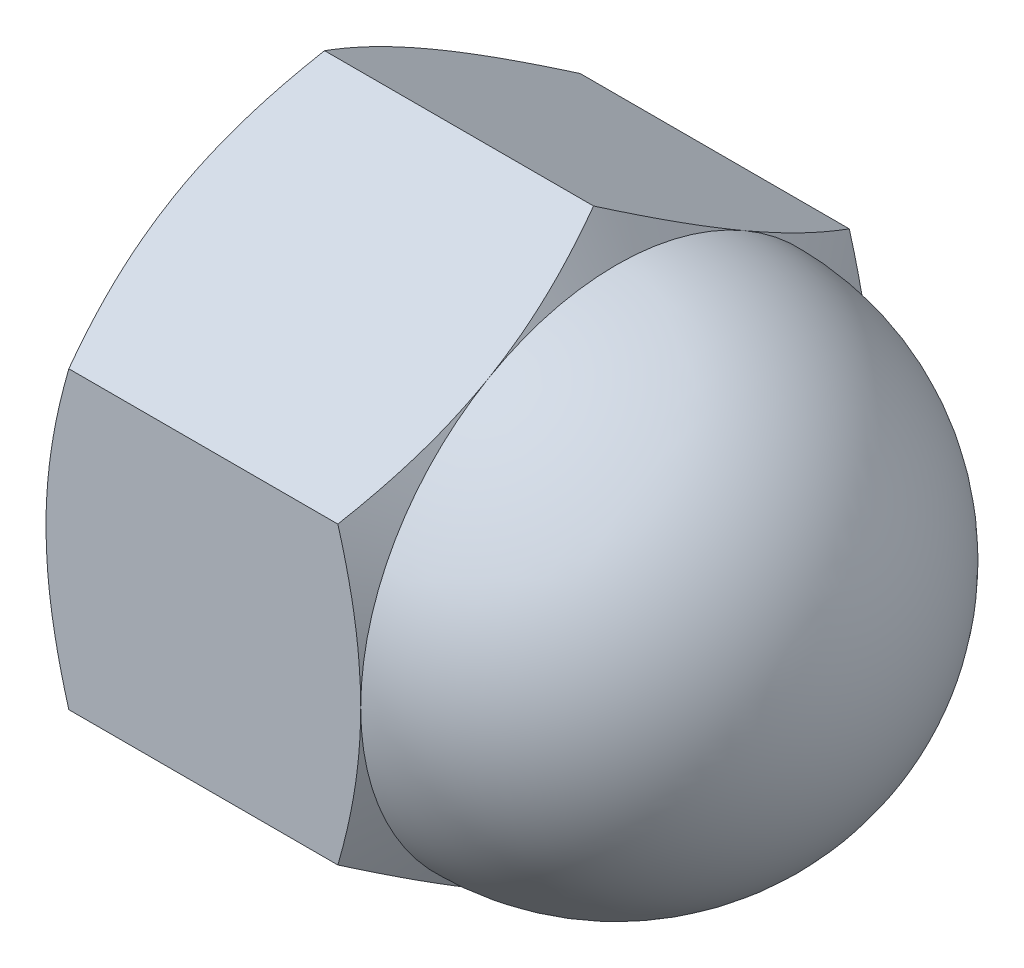
ISO-10303-21;
HEADER;
FILE_DESCRIPTION(('STEP AP214'),'2;1');
FILE_NAME('part.step','',(''),(''),'','','');
FILE_SCHEMA(('AUTOMOTIVE_DESIGN { 1 0 10303 214 1 1 1 1 }'));
ENDSEC;
DATA;
#1=APPLICATION_CONTEXT('core data for automotive mechanical design processes');
#2=APPLICATION_PROTOCOL_DEFINITION('international standard','automotive_design',2000,#1);
#3=PRODUCT_CONTEXT('',#1,'mechanical');
#4=PRODUCT('Part','Part','',(#3));
#5=PRODUCT_RELATED_PRODUCT_CATEGORY('part','',(#4));
#6=PRODUCT_DEFINITION_FORMATION('','',#4);
#7=PRODUCT_DEFINITION_CONTEXT('part definition',#1,'design');
#8=PRODUCT_DEFINITION('design','',#6,#7);
#9=PRODUCT_DEFINITION_SHAPE('','',#8);
#10=(LENGTH_UNIT() NAMED_UNIT(*) SI_UNIT(.MILLI.,.METRE.));
#11=(NAMED_UNIT(*) PLANE_ANGLE_UNIT() SI_UNIT($,.RADIAN.));
#12=(NAMED_UNIT(*) SI_UNIT($,.STERADIAN.) SOLID_ANGLE_UNIT());
#13=UNCERTAINTY_MEASURE_WITH_UNIT(LENGTH_MEASURE(1.E-05),#10,'distance_accuracy_value','');
#14=(GEOMETRIC_REPRESENTATION_CONTEXT(3) GLOBAL_UNCERTAINTY_ASSIGNED_CONTEXT((#13)) GLOBAL_UNIT_ASSIGNED_CONTEXT((#10,
#11,#12)) REPRESENTATION_CONTEXT('',''));
#15=CARTESIAN_POINT('',(0.,0.,0.));
#16=DIRECTION('',(0.,0.,1.));
#17=DIRECTION('',(1.,0.,0.));
#18=AXIS2_PLACEMENT_3D('',#15,#16,#17);
#19=CARTESIAN_POINT('',(4.1353125,0.,0.));
#20=DIRECTION('',(-1.,0.,0.));
#21=DIRECTION('',(0.,1.,0.));
#22=AXIS2_PLACEMENT_3D('',#19,#20,#21);
#23=CYLINDRICAL_SURFACE('',#22,3.729375);
#24=CARTESIAN_POINT('',(8.,0.,0.));
#25=DIRECTION('',(1.,0.,0.));
#26=DIRECTION('',(0.,1.,0.));
#27=AXIS2_PLACEMENT_3D('',#24,#25,#26);
#28=CIRCLE('',#27,3.729375);
#29=CARTESIAN_POINT('',(8.,3.729375,0.));
#30=VERTEX_POINT('',#29);
#31=EDGE_CURVE('E11',#30,#30,#28,.T.);
#32=ORIENTED_EDGE('',*,*,#31,.T.);
#33=EDGE_LOOP('',(#32));
#34=FACE_BOUND('',#33,.T.);
#35=CARTESIAN_POINT('',(0.270625,0.,0.));
#36=DIRECTION('',(1.,0.,0.));
#37=DIRECTION('',(0.,1.,0.));
#38=AXIS2_PLACEMENT_3D('',#35,#36,#37);
#39=CIRCLE('',#38,3.729375);
#40=CARTESIAN_POINT('',(0.270625,3.729375,0.));
#41=VERTEX_POINT('',#40);
#42=EDGE_CURVE('E25',#41,#41,#39,.T.);
#43=ORIENTED_EDGE('',*,*,#42,.F.);
#44=EDGE_LOOP('',(#43));
#45=FACE_BOUND('',#44,.T.);
#46=ADVANCED_FACE('F17',(#34,#45),#23,.F.);
#47=CARTESIAN_POINT('',(8.,1.8646875,0.));
#48=DIRECTION('',(1.,0.,0.));
#49=DIRECTION('',(0.,1.,0.));
#50=AXIS2_PLACEMENT_3D('',#47,#48,#49);
#51=PLANE('',#50);
#52=ORIENTED_EDGE('',*,*,#31,.F.);
#53=EDGE_LOOP('',(#52));
#54=FACE_BOUND('',#53,.T.);
#55=ADVANCED_FACE('F422',(#54),#51,.F.);
#56=CARTESIAN_POINT('',(0.1353125,0.,0.));
#57=DIRECTION('',(-1.,0.,0.));
#58=DIRECTION('',(0.,1.,0.));
#59=AXIS2_PLACEMENT_3D('',#56,#57,#58);
#60=CONICAL_SURFACE('',#59,3.8646875,0.785398163397448);
#61=ORIENTED_EDGE('',*,*,#42,.T.);
#62=EDGE_LOOP('',(#61));
#63=FACE_BOUND('',#62,.T.);
#64=CARTESIAN_POINT('',(0.,0.,0.));
#65=DIRECTION('',(1.,0.,0.));
#66=DIRECTION('',(0.,1.,0.));
#67=AXIS2_PLACEMENT_3D('',#64,#65,#66);
#68=CIRCLE('',#67,4.);
#69=CARTESIAN_POINT('',(0.,4.,0.));
#70=VERTEX_POINT('',#69);
#71=EDGE_CURVE('E393',#70,#70,#68,.T.);
#72=ORIENTED_EDGE('',*,*,#71,.F.);
#73=EDGE_LOOP('',(#72));
#74=FACE_BOUND('',#73,.T.);
#75=ADVANCED_FACE('F418',(#63,#74),#60,.F.);
#76=CARTESIAN_POINT('',(8.,0.,0.));
#77=DIRECTION('',(0.,0.,1.));
#78=DIRECTION('',(1.,0.,0.));
#79=AXIS2_PLACEMENT_3D('',#76,#77,#78);
#80=SPHERICAL_SURFACE('',#79,6.5);
#81=CARTESIAN_POINT('',(8.,0.,0.));
#82=DIRECTION('',(1.,0.,0.));
#83=DIRECTION('',(0.,1.,0.));
#84=AXIS2_PLACEMENT_3D('',#81,#82,#83);
#85=SPHERICAL_SURFACE('',#84,6.5);
#86=CARTESIAN_POINT('',(8.,0.,0.));
#87=DIRECTION('',(1.,0.,0.));
#88=DIRECTION('',(0.,1.,0.));
#89=AXIS2_PLACEMENT_3D('',#86,#87,#88);
#90=CIRCLE('',#89,6.5);
#91=CARTESIAN_POINT('',(8.,5.62916512459885,-3.25));
#92=VERTEX_POINT('',#91);
#93=CARTESIAN_POINT('',(8.,5.62916512459885,3.25));
#94=VERTEX_POINT('',#93);
#95=EDGE_CURVE('E37',#92,#94,#90,.T.);
#96=ORIENTED_EDGE('',*,*,#95,.T.);
#97=CARTESIAN_POINT('',(8.,0.,0.));
#98=DIRECTION('',(1.,0.,0.));
#99=DIRECTION('',(0.,1.,0.));
#100=AXIS2_PLACEMENT_3D('',#97,#98,#99);
#101=CIRCLE('',#100,6.5);
#102=CARTESIAN_POINT('',(8.,0.,6.5));
#103=VERTEX_POINT('',#102);
#104=EDGE_CURVE('E405',#94,#103,#101,.T.);
#105=ORIENTED_EDGE('',*,*,#104,.T.);
#106=CARTESIAN_POINT('',(8.,0.,0.));
#107=DIRECTION('',(1.,0.,0.));
#108=DIRECTION('',(0.,1.,0.));
#109=AXIS2_PLACEMENT_3D('',#106,#107,#108);
#110=CIRCLE('',#109,6.5);
#111=CARTESIAN_POINT('',(8.,-5.62916512459885,3.25));
#112=VERTEX_POINT('',#111);
#113=EDGE_CURVE('E402',#103,#112,#110,.T.);
#114=ORIENTED_EDGE('',*,*,#113,.T.);
#115=CARTESIAN_POINT('',(8.,0.,0.));
#116=DIRECTION('',(1.,0.,0.));
#117=DIRECTION('',(0.,1.,0.));
#118=AXIS2_PLACEMENT_3D('',#115,#116,#117);
#119=CIRCLE('',#118,6.5);
#120=CARTESIAN_POINT('',(8.,-5.62916512459885,-3.25));
#121=VERTEX_POINT('',#120);
#122=EDGE_CURVE('E399',#112,#121,#119,.T.);
#123=ORIENTED_EDGE('',*,*,#122,.T.);
#124=CARTESIAN_POINT('',(8.,0.,0.));
#125=DIRECTION('',(1.,0.,0.));
#126=DIRECTION('',(0.,1.,0.));
#127=AXIS2_PLACEMENT_3D('',#124,#125,#126);
#128=CIRCLE('',#127,6.5);
#129=CARTESIAN_POINT('',(8.,0.,-6.5));
#130=VERTEX_POINT('',#129);
#131=EDGE_CURVE('E158',#121,#130,#128,.T.);
#132=ORIENTED_EDGE('',*,*,#131,.T.);
#133=CARTESIAN_POINT('',(8.,0.,0.));
#134=DIRECTION('',(1.,0.,0.));
#135=DIRECTION('',(0.,1.,0.));
#136=AXIS2_PLACEMENT_3D('',#133,#134,#135);
#137=CIRCLE('',#136,6.5);
#138=EDGE_CURVE('E410',#130,#92,#137,.T.);
#139=ORIENTED_EDGE('',*,*,#138,.T.);
#140=EDGE_LOOP('',(#96,#105,#114,#123,#132,#139));
#141=FACE_BOUND('',#140,.T.);
#142=ADVANCED_FACE('F433',(#141),#85,.T.);
#143=CARTESIAN_POINT('',(0.290915625,0.,0.));
#144=DIRECTION('',(1.,0.,0.));
#145=DIRECTION('',(0.,1.,0.));
#146=AXIS2_PLACEMENT_3D('',#143,#144,#145);
#147=CONICAL_SURFACE('',#146,7.00388064321566,1.0471975511966);
#148=CARTESIAN_POINT('',(0.581831250000001,-3.75719037766743,6.5));
#149=CARTESIAN_POINT('',(0.,-1.74344329229072,6.49999999999999));
#150=CARTESIAN_POINT('',(0.,0.,6.5));
#151=CARTESIAN_POINT('',(0.,1.74344329229071,6.49999999999999));
#152=CARTESIAN_POINT('',(0.581831250000001,3.75719037766743,6.5));
#153=(BOUNDED_CURVE() B_SPLINE_CURVE(2,(#148,#149,#150,#151,#152),.UNSPECIFIED.,.F.,
.F.) B_SPLINE_CURVE_WITH_KNOTS((3,2,3),(0.,3.81169807597373,7.62339615194746),
.UNSPECIFIED.) CURVE() GEOMETRIC_REPRESENTATION_ITEM() RATIONAL_B_SPLINE_CURVE((1.,
1.03803665588277,1.,1.03803665588275,1.)) REPRESENTATION_ITEM(''));
#154=CARTESIAN_POINT('',(0.580556583600766,-3.75277674973256,6.5));
#155=VERTEX_POINT('',#154);
#156=CARTESIAN_POINT('',(0.,0.,6.5));
#157=VERTEX_POINT('',#156);
#158=EDGE_CURVE('E191',#155,#157,#153,.T.);
#159=ORIENTED_EDGE('',*,*,#158,.T.);
#160=CARTESIAN_POINT('',(0.,0.,0.));
#161=DIRECTION('',(1.,0.,0.));
#162=DIRECTION('',(0.,1.,0.));
#163=AXIS2_PLACEMENT_3D('',#160,#161,#162);
#164=CIRCLE('',#163,6.5);
#165=CARTESIAN_POINT('',(0.,-5.62916512459885,3.25));
#166=VERTEX_POINT('',#165);
#167=EDGE_CURVE('E273',#157,#166,#164,.T.);
#168=ORIENTED_EDGE('',*,*,#167,.T.);
#169=CARTESIAN_POINT('',(0.581831250000001,-7.50776031343257,-0.00382231391444033));
#170=CARTESIAN_POINT('',(0.,-6.50088677074421,1.74013381881866));
#171=CARTESIAN_POINT('',(0.,-5.62916512459885,3.25));
#172=CARTESIAN_POINT('',(0.,-4.75744347845349,4.75986618118135));
#173=CARTESIAN_POINT('',(0.581831250000001,-3.75056993576513,6.50382231391444));
#174=(BOUNDED_CURVE() B_SPLINE_CURVE(2,(#169,#170,#171,#172,#173),.UNSPECIFIED.,.F.,
.F.) B_SPLINE_CURVE_WITH_KNOTS((3,2,3),(0.,3.81169807597372,7.62339615194745),
.UNSPECIFIED.) CURVE() GEOMETRIC_REPRESENTATION_ITEM() RATIONAL_B_SPLINE_CURVE((1.,
1.03803665588275,1.,1.03803665588276,1.)) REPRESENTATION_ITEM(''));
#175=EDGE_CURVE('E177',#166,#155,#174,.T.);
#176=ORIENTED_EDGE('',*,*,#175,.T.);
#177=EDGE_LOOP('',(#159,#168,#176));
#178=FACE_BOUND('',#177,.T.);
#179=ADVANCED_FACE('F438',(#178),#147,.T.);
#180=CARTESIAN_POINT('',(0.290915625,0.,0.));
#181=DIRECTION('',(1.,0.,0.));
#182=DIRECTION('',(0.,1.,0.));
#183=AXIS2_PLACEMENT_3D('',#180,#181,#182);
#184=CONICAL_SURFACE('',#183,7.00388064321566,1.0471975511966);
#185=CARTESIAN_POINT('',(0.581831250000001,3.75056993576514,6.50382231391444));
#186=CARTESIAN_POINT('',(0.,4.75744347845349,4.75986618118133));
#187=CARTESIAN_POINT('',(0.,5.62916512459885,3.25));
#188=CARTESIAN_POINT('',(0.,6.5008867707442,1.74013381881866));
#189=CARTESIAN_POINT('',(0.581831250000001,7.50776031343257,-0.00382231391444699));
#190=(BOUNDED_CURVE() B_SPLINE_CURVE(2,(#185,#186,#187,#188,#189),.UNSPECIFIED.,.F.,
.F.) B_SPLINE_CURVE_WITH_KNOTS((3,2,3),(0.,3.81169807597373,7.62339615194745),
.UNSPECIFIED.) CURVE() GEOMETRIC_REPRESENTATION_ITEM() RATIONAL_B_SPLINE_CURVE((1.,
1.03803665588275,1.,1.03803665588275,1.)) REPRESENTATION_ITEM(''));
#191=CARTESIAN_POINT('',(0.580556583600766,3.75277674973257,6.5));
#192=VERTEX_POINT('',#191);
#193=CARTESIAN_POINT('',(0.,5.62916512459885,3.25));
#194=VERTEX_POINT('',#193);
#195=EDGE_CURVE('E248',#192,#194,#190,.T.);
#196=ORIENTED_EDGE('',*,*,#195,.T.);
#197=CARTESIAN_POINT('',(0.,0.,0.));
#198=DIRECTION('',(1.,0.,0.));
#199=DIRECTION('',(0.,1.,0.));
#200=AXIS2_PLACEMENT_3D('',#197,#198,#199);
#201=CIRCLE('',#200,6.5);
#202=EDGE_CURVE('E47',#194,#157,#201,.T.);
#203=ORIENTED_EDGE('',*,*,#202,.T.);
#204=CARTESIAN_POINT('',(0.581831250000001,-3.75719037766743,6.5));
#205=CARTESIAN_POINT('',(0.,-1.74344329229072,6.49999999999999));
#206=CARTESIAN_POINT('',(0.,0.,6.5));
#207=CARTESIAN_POINT('',(0.,1.74344329229071,6.49999999999999));
#208=CARTESIAN_POINT('',(0.581831250000001,3.75719037766743,6.5));
#209=(BOUNDED_CURVE() B_SPLINE_CURVE(2,(#204,#205,#206,#207,#208),.UNSPECIFIED.,.F.,
.F.) B_SPLINE_CURVE_WITH_KNOTS((3,2,3),(0.,3.81169807597373,7.62339615194746),
.UNSPECIFIED.) CURVE() GEOMETRIC_REPRESENTATION_ITEM() RATIONAL_B_SPLINE_CURVE((1.,
1.03803665588277,1.,1.03803665588275,1.)) REPRESENTATION_ITEM(''));
#210=EDGE_CURVE('E201',#157,#192,#209,.T.);
#211=ORIENTED_EDGE('',*,*,#210,.T.);
#212=EDGE_LOOP('',(#196,#203,#211));
#213=FACE_BOUND('',#212,.T.);
#214=ADVANCED_FACE('F441',(#213),#184,.T.);
#215=CARTESIAN_POINT('',(0.290915625,0.,0.));
#216=DIRECTION('',(1.,0.,0.));
#217=DIRECTION('',(0.,1.,0.));
#218=AXIS2_PLACEMENT_3D('',#215,#216,#217);
#219=CONICAL_SURFACE('',#218,7.00388064321566,1.0471975511966);
#220=CARTESIAN_POINT('',(0.581831250000001,7.50776031343257,0.00382231391443985));
#221=CARTESIAN_POINT('',(0.,6.50088677074421,-1.74013381881866));
#222=CARTESIAN_POINT('',(0.,5.62916512459885,-3.25));
#223=CARTESIAN_POINT('',(0.,4.75744347845348,-4.75986618118135));
#224=CARTESIAN_POINT('',(0.581831250000001,3.75056993576513,-6.50382231391445));
#225=(BOUNDED_CURVE() B_SPLINE_CURVE(2,(#220,#221,#222,#223,#224),.UNSPECIFIED.,.F.,
.F.) B_SPLINE_CURVE_WITH_KNOTS((3,2,3),(0.,3.81169807597372,7.62339615194745),
.UNSPECIFIED.) CURVE() GEOMETRIC_REPRESENTATION_ITEM() RATIONAL_B_SPLINE_CURVE((1.,
1.03803665588277,1.,1.03803665588275,1.)) REPRESENTATION_ITEM(''));
#226=CARTESIAN_POINT('',(0.580556583600766,7.50555349946513,0.));
#227=VERTEX_POINT('',#226);
#228=CARTESIAN_POINT('',(0.,5.62916512459885,-3.25));
#229=VERTEX_POINT('',#228);
#230=EDGE_CURVE('E284',#227,#229,#225,.T.);
#231=ORIENTED_EDGE('',*,*,#230,.T.);
#232=CARTESIAN_POINT('',(0.,0.,0.));
#233=DIRECTION('',(1.,0.,0.));
#234=DIRECTION('',(0.,1.,0.));
#235=AXIS2_PLACEMENT_3D('',#232,#233,#234);
#236=CIRCLE('',#235,6.5);
#237=EDGE_CURVE('E341',#229,#194,#236,.T.);
#238=ORIENTED_EDGE('',*,*,#237,.T.);
#239=CARTESIAN_POINT('',(0.581831250000001,3.75056993576514,6.50382231391444));
#240=CARTESIAN_POINT('',(0.,4.75744347845349,4.75986618118133));
#241=CARTESIAN_POINT('',(0.,5.62916512459885,3.25));
#242=CARTESIAN_POINT('',(0.,6.5008867707442,1.74013381881866));
#243=CARTESIAN_POINT('',(0.581831250000001,7.50776031343257,-0.00382231391444699));
#244=(BOUNDED_CURVE() B_SPLINE_CURVE(2,(#239,#240,#241,#242,#243),.UNSPECIFIED.,.F.,
.F.) B_SPLINE_CURVE_WITH_KNOTS((3,2,3),(0.,3.81169807597373,7.62339615194745),
.UNSPECIFIED.) CURVE() GEOMETRIC_REPRESENTATION_ITEM() RATIONAL_B_SPLINE_CURVE((1.,
1.03803665588275,1.,1.03803665588275,1.)) REPRESENTATION_ITEM(''));
#245=EDGE_CURVE('E365',#194,#227,#244,.T.);
#246=ORIENTED_EDGE('',*,*,#245,.T.);
#247=EDGE_LOOP('',(#231,#238,#246));
#248=FACE_BOUND('',#247,.T.);
#249=ADVANCED_FACE('F443',(#248),#219,.T.);
#250=CARTESIAN_POINT('',(0.290915625,0.,0.));
#251=DIRECTION('',(1.,0.,0.));
#252=DIRECTION('',(0.,1.,0.));
#253=AXIS2_PLACEMENT_3D('',#250,#251,#252);
#254=CONICAL_SURFACE('',#253,7.00388064321566,1.0471975511966);
#255=CARTESIAN_POINT('',(0.581831250000001,7.50776031343257,0.00382231391443985));
#256=CARTESIAN_POINT('',(0.,6.50088677074421,-1.74013381881866));
#257=CARTESIAN_POINT('',(0.,5.62916512459885,-3.25));
#258=CARTESIAN_POINT('',(0.,4.75744347845348,-4.75986618118135));
#259=CARTESIAN_POINT('',(0.581831250000001,3.75056993576513,-6.50382231391445));
#260=(BOUNDED_CURVE() B_SPLINE_CURVE(2,(#255,#256,#257,#258,#259),.UNSPECIFIED.,.F.,
.F.) B_SPLINE_CURVE_WITH_KNOTS((3,2,3),(0.,3.81169807597372,7.62339615194745),
.UNSPECIFIED.) CURVE() GEOMETRIC_REPRESENTATION_ITEM() RATIONAL_B_SPLINE_CURVE((1.,
1.03803665588277,1.,1.03803665588275,1.)) REPRESENTATION_ITEM(''));
#261=CARTESIAN_POINT('',(0.580556583600766,3.75277674973256,-6.5));
#262=VERTEX_POINT('',#261);
#263=EDGE_CURVE('E249',#229,#262,#260,.T.);
#264=ORIENTED_EDGE('',*,*,#263,.T.);
#265=CARTESIAN_POINT('',(0.581831250000001,3.75719037766743,-6.5));
#266=CARTESIAN_POINT('',(0.,1.74344329229072,-6.50000000000001));
#267=CARTESIAN_POINT('',(0.,0.,-6.5));
#268=CARTESIAN_POINT('',(0.,-1.74344329229072,-6.50000000000001));
#269=CARTESIAN_POINT('',(0.581831250000001,-3.75719037766743,-6.5));
#270=(BOUNDED_CURVE() B_SPLINE_CURVE(2,(#265,#266,#267,#268,#269),.UNSPECIFIED.,.F.,
.F.) B_SPLINE_CURVE_WITH_KNOTS((3,2,3),(0.,3.81169807597372,7.62339615194745),
.UNSPECIFIED.) CURVE() GEOMETRIC_REPRESENTATION_ITEM() RATIONAL_B_SPLINE_CURVE((1.,
1.03803665588276,1.,1.03803665588276,1.)) REPRESENTATION_ITEM(''));
#271=CARTESIAN_POINT('',(0.,0.,-6.5));
#272=VERTEX_POINT('',#271);
#273=EDGE_CURVE('E202',#262,#272,#270,.T.);
#274=ORIENTED_EDGE('',*,*,#273,.T.);
#275=CARTESIAN_POINT('',(0.,0.,0.));
#276=DIRECTION('',(1.,0.,0.));
#277=DIRECTION('',(0.,1.,0.));
#278=AXIS2_PLACEMENT_3D('',#275,#276,#277);
#279=CIRCLE('',#278,6.5);
#280=EDGE_CURVE('E383',#272,#229,#279,.T.);
#281=ORIENTED_EDGE('',*,*,#280,.T.);
#282=EDGE_LOOP('',(#264,#274,#281));
#283=FACE_BOUND('',#282,.T.);
#284=ADVANCED_FACE('F446',(#283),#254,.T.);
#285=CARTESIAN_POINT('',(0.290915625,0.,0.));
#286=DIRECTION('',(1.,0.,0.));
#287=DIRECTION('',(0.,1.,0.));
#288=AXIS2_PLACEMENT_3D('',#285,#286,#287);
#289=CONICAL_SURFACE('',#288,7.00388064321566,1.0471975511966);
#290=CARTESIAN_POINT('',(0.581831250000001,3.75719037766743,-6.5));
#291=CARTESIAN_POINT('',(0.,1.74344329229072,-6.50000000000001));
#292=CARTESIAN_POINT('',(0.,0.,-6.5));
#293=CARTESIAN_POINT('',(0.,-1.74344329229072,-6.50000000000001));
#294=CARTESIAN_POINT('',(0.581831250000001,-3.75719037766743,-6.5));
#295=(BOUNDED_CURVE() B_SPLINE_CURVE(2,(#290,#291,#292,#293,#294),.UNSPECIFIED.,.F.,
.F.) B_SPLINE_CURVE_WITH_KNOTS((3,2,3),(0.,3.81169807597372,7.62339615194745),
.UNSPECIFIED.) CURVE() GEOMETRIC_REPRESENTATION_ITEM() RATIONAL_B_SPLINE_CURVE((1.,
1.03803665588276,1.,1.03803665588276,1.)) REPRESENTATION_ITEM(''));
#296=CARTESIAN_POINT('',(0.580556583600766,-3.75277674973257,-6.5));
#297=VERTEX_POINT('',#296);
#298=EDGE_CURVE('E152',#272,#297,#295,.T.);
#299=ORIENTED_EDGE('',*,*,#298,.T.);
#300=CARTESIAN_POINT('',(0.581831250000001,-3.75056993576513,-6.50382231391444));
#301=CARTESIAN_POINT('',(0.,-4.75744347845348,-4.75986618118134));
#302=CARTESIAN_POINT('',(0.,-5.62916512459885,-3.25));
#303=CARTESIAN_POINT('',(0.,-6.50088677074421,-1.74013381881865));
#304=CARTESIAN_POINT('',(0.581831250000001,-7.50776031343257,0.00382231391444556));
#305=(BOUNDED_CURVE() B_SPLINE_CURVE(2,(#300,#301,#302,#303,#304),.UNSPECIFIED.,.F.,
.F.) B_SPLINE_CURVE_WITH_KNOTS((3,2,3),(0.,3.81169807597373,7.62339615194745),
.UNSPECIFIED.) CURVE() GEOMETRIC_REPRESENTATION_ITEM() RATIONAL_B_SPLINE_CURVE((1.,
1.03803665588277,1.,1.03803665588277,1.)) REPRESENTATION_ITEM(''));
#306=CARTESIAN_POINT('',(0.,-5.62916512459885,-3.25));
#307=VERTEX_POINT('',#306);
#308=EDGE_CURVE('E168',#297,#307,#305,.T.);
#309=ORIENTED_EDGE('',*,*,#308,.T.);
#310=CARTESIAN_POINT('',(0.,0.,0.));
#311=DIRECTION('',(1.,0.,0.));
#312=DIRECTION('',(0.,1.,0.));
#313=AXIS2_PLACEMENT_3D('',#310,#311,#312);
#314=CIRCLE('',#313,6.5);
#315=EDGE_CURVE('E386',#307,#272,#314,.T.);
#316=ORIENTED_EDGE('',*,*,#315,.T.);
#317=EDGE_LOOP('',(#299,#309,#316));
#318=FACE_BOUND('',#317,.T.);
#319=ADVANCED_FACE('F452',(#318),#289,.T.);
#320=CARTESIAN_POINT('',(0.290915625,0.,0.));
#321=DIRECTION('',(1.,0.,0.));
#322=DIRECTION('',(0.,1.,0.));
#323=AXIS2_PLACEMENT_3D('',#320,#321,#322);
#324=CONICAL_SURFACE('',#323,7.00388064321566,1.0471975511966);
#325=CARTESIAN_POINT('',(0.581831250000001,-3.75056993576513,-6.50382231391444));
#326=CARTESIAN_POINT('',(0.,-4.75744347845348,-4.75986618118134));
#327=CARTESIAN_POINT('',(0.,-5.62916512459885,-3.25));
#328=CARTESIAN_POINT('',(0.,-6.50088677074421,-1.74013381881865));
#329=CARTESIAN_POINT('',(0.581831250000001,-7.50776031343257,0.00382231391444556));
#330=(BOUNDED_CURVE() B_SPLINE_CURVE(2,(#325,#326,#327,#328,#329),.UNSPECIFIED.,.F.,
.F.) B_SPLINE_CURVE_WITH_KNOTS((3,2,3),(0.,3.81169807597373,7.62339615194745),
.UNSPECIFIED.) CURVE() GEOMETRIC_REPRESENTATION_ITEM() RATIONAL_B_SPLINE_CURVE((1.,
1.03803665588277,1.,1.03803665588277,1.)) REPRESENTATION_ITEM(''));
#331=CARTESIAN_POINT('',(0.580556583600766,-7.50555349946513,0.));
#332=VERTEX_POINT('',#331);
#333=EDGE_CURVE('E212',#307,#332,#330,.T.);
#334=ORIENTED_EDGE('',*,*,#333,.T.);
#335=CARTESIAN_POINT('',(0.581831250000001,-7.50776031343257,-0.00382231391444033));
#336=CARTESIAN_POINT('',(0.,-6.50088677074421,1.74013381881866));
#337=CARTESIAN_POINT('',(0.,-5.62916512459885,3.25));
#338=CARTESIAN_POINT('',(0.,-4.75744347845349,4.75986618118135));
#339=CARTESIAN_POINT('',(0.581831250000001,-3.75056993576513,6.50382231391444));
#340=(BOUNDED_CURVE() B_SPLINE_CURVE(2,(#335,#336,#337,#338,#339),.UNSPECIFIED.,.F.,
.F.) B_SPLINE_CURVE_WITH_KNOTS((3,2,3),(0.,3.81169807597372,7.62339615194745),
.UNSPECIFIED.) CURVE() GEOMETRIC_REPRESENTATION_ITEM() RATIONAL_B_SPLINE_CURVE((1.,
1.03803665588275,1.,1.03803665588276,1.)) REPRESENTATION_ITEM(''));
#341=EDGE_CURVE('E307',#332,#166,#340,.T.);
#342=ORIENTED_EDGE('',*,*,#341,.T.);
#343=CARTESIAN_POINT('',(0.,0.,0.));
#344=DIRECTION('',(1.,0.,0.));
#345=DIRECTION('',(0.,1.,0.));
#346=AXIS2_PLACEMENT_3D('',#343,#344,#345);
#347=CIRCLE('',#346,6.5);
#348=EDGE_CURVE('E279',#166,#307,#347,.T.);
#349=ORIENTED_EDGE('',*,*,#348,.T.);
#350=EDGE_LOOP('',(#334,#342,#349));
#351=FACE_BOUND('',#350,.T.);
#352=ADVANCED_FACE('F448',(#351),#324,.T.);
#353=CARTESIAN_POINT('',(7.709084375,0.,0.));
#354=DIRECTION('',(-1.,0.,0.));
#355=DIRECTION('',(0.,1.,0.));
#356=AXIS2_PLACEMENT_3D('',#353,#354,#355);
#357=CONICAL_SURFACE('',#356,7.00388064321566,1.0471975511966);
#358=CARTESIAN_POINT('',(7.41816875,3.75056993576513,-6.50382231391445));
#359=CARTESIAN_POINT('',(8.00000000000001,4.75744347845349,-4.75986618118135));
#360=CARTESIAN_POINT('',(8.,5.62916512459885,-3.25));
#361=CARTESIAN_POINT('',(8.00000000000001,6.50088677074421,-1.74013381881866));
#362=CARTESIAN_POINT('',(7.41816875,7.50776031343257,0.0038223139144408));
#363=(BOUNDED_CURVE() B_SPLINE_CURVE(2,(#358,#359,#360,#361,#362),.UNSPECIFIED.,.F.,
.F.) B_SPLINE_CURVE_WITH_KNOTS((3,2,3),(0.,3.81169807597373,7.62339615194746),
.UNSPECIFIED.) CURVE() GEOMETRIC_REPRESENTATION_ITEM() RATIONAL_B_SPLINE_CURVE((1.,
1.03803665588276,1.,1.03803665588275,1.)) REPRESENTATION_ITEM(''));
#364=CARTESIAN_POINT('',(7.41944341639924,3.75277674973256,-6.5));
#365=VERTEX_POINT('',#364);
#366=EDGE_CURVE('E256',#365,#92,#363,.T.);
#367=ORIENTED_EDGE('',*,*,#366,.T.);
#368=ORIENTED_EDGE('',*,*,#138,.F.);
#369=CARTESIAN_POINT('',(7.41816875,-3.75719037766743,-6.5));
#370=CARTESIAN_POINT('',(8.,-1.74344329229073,-6.49999999999999));
#371=CARTESIAN_POINT('',(8.,0.,-6.5));
#372=CARTESIAN_POINT('',(8.,1.74344329229073,-6.49999999999999));
#373=CARTESIAN_POINT('',(7.41816875,3.75719037766743,-6.5));
#374=(BOUNDED_CURVE() B_SPLINE_CURVE(2,(#369,#370,#371,#372,#373),.UNSPECIFIED.,.F.,
.F.) B_SPLINE_CURVE_WITH_KNOTS((3,2,3),(0.,3.81169807597373,7.62339615194746),
.UNSPECIFIED.) CURVE() GEOMETRIC_REPRESENTATION_ITEM() RATIONAL_B_SPLINE_CURVE((1.,
1.03803665588275,1.,1.03803665588275,1.)) REPRESENTATION_ITEM(''));
#375=EDGE_CURVE('E148',#130,#365,#374,.T.);
#376=ORIENTED_EDGE('',*,*,#375,.T.);
#377=EDGE_LOOP('',(#367,#368,#376));
#378=FACE_BOUND('',#377,.T.);
#379=ADVANCED_FACE('F451',(#378),#357,.T.);
#380=CARTESIAN_POINT('',(7.709084375,0.,0.));
#381=DIRECTION('',(-1.,0.,0.));
#382=DIRECTION('',(0.,1.,0.));
#383=AXIS2_PLACEMENT_3D('',#380,#381,#382);
#384=CONICAL_SURFACE('',#383,7.00388064321566,1.0471975511966);
#385=CARTESIAN_POINT('',(7.41816875,7.50776031343257,-0.00382231391444318));
#386=CARTESIAN_POINT('',(8.00000000000001,6.50088677074421,1.74013381881866));
#387=CARTESIAN_POINT('',(8.,5.62916512459885,3.25));
#388=CARTESIAN_POINT('',(8.00000000000001,4.7574434784535,4.75986618118133));
#389=CARTESIAN_POINT('',(7.41816875,3.75056993576514,6.50382231391444));
#390=(BOUNDED_CURVE() B_SPLINE_CURVE(2,(#385,#386,#387,#388,#389),.UNSPECIFIED.,.F.,
.F.) B_SPLINE_CURVE_WITH_KNOTS((3,2,3),(0.,3.81169807597372,7.62339615194745),
.UNSPECIFIED.) CURVE() GEOMETRIC_REPRESENTATION_ITEM() RATIONAL_B_SPLINE_CURVE((1.,
1.03803665588274,1.,1.03803665588274,1.)) REPRESENTATION_ITEM(''));
#391=CARTESIAN_POINT('',(7.41944341639923,7.50555349946513,0.));
#392=VERTEX_POINT('',#391);
#393=EDGE_CURVE('E247',#392,#94,#390,.T.);
#394=ORIENTED_EDGE('',*,*,#393,.T.);
#395=ORIENTED_EDGE('',*,*,#95,.F.);
#396=CARTESIAN_POINT('',(7.41816875,3.75056993576513,-6.50382231391445));
#397=CARTESIAN_POINT('',(8.00000000000001,4.75744347845349,-4.75986618118135));
#398=CARTESIAN_POINT('',(8.,5.62916512459885,-3.25));
#399=CARTESIAN_POINT('',(8.00000000000001,6.50088677074421,-1.74013381881866));
#400=CARTESIAN_POINT('',(7.41816875,7.50776031343257,0.0038223139144408));
#401=(BOUNDED_CURVE() B_SPLINE_CURVE(2,(#396,#397,#398,#399,#400),.UNSPECIFIED.,.F.,
.F.) B_SPLINE_CURVE_WITH_KNOTS((3,2,3),(0.,3.81169807597373,7.62339615194746),
.UNSPECIFIED.) CURVE() GEOMETRIC_REPRESENTATION_ITEM() RATIONAL_B_SPLINE_CURVE((1.,
1.03803665588276,1.,1.03803665588275,1.)) REPRESENTATION_ITEM(''));
#402=EDGE_CURVE('E263',#92,#392,#401,.T.);
#403=ORIENTED_EDGE('',*,*,#402,.T.);
#404=EDGE_LOOP('',(#394,#395,#403));
#405=FACE_BOUND('',#404,.T.);
#406=ADVANCED_FACE('F466',(#405),#384,.T.);
#407=CARTESIAN_POINT('',(7.709084375,0.,0.));
#408=DIRECTION('',(-1.,0.,0.));
#409=DIRECTION('',(0.,1.,0.));
#410=AXIS2_PLACEMENT_3D('',#407,#408,#409);
#411=CONICAL_SURFACE('',#410,7.00388064321566,1.0471975511966);
#412=CARTESIAN_POINT('',(7.41816875,3.75719037766743,6.5));
#413=CARTESIAN_POINT('',(8.00000000000001,1.74344329229074,6.50000000000001));
#414=CARTESIAN_POINT('',(8.,0.,6.5));
#415=CARTESIAN_POINT('',(8.,-1.74344329229073,6.5));
#416=CARTESIAN_POINT('',(7.41816875,-3.75719037766743,6.5));
#417=(BOUNDED_CURVE() B_SPLINE_CURVE(2,(#412,#413,#414,#415,#416),.UNSPECIFIED.,.F.,
.F.) B_SPLINE_CURVE_WITH_KNOTS((3,2,3),(0.,3.81169807597373,7.62339615194746),
.UNSPECIFIED.) CURVE() GEOMETRIC_REPRESENTATION_ITEM() RATIONAL_B_SPLINE_CURVE((1.,
1.03803665588276,1.,1.03803665588277,1.)) REPRESENTATION_ITEM(''));
#418=CARTESIAN_POINT('',(7.41944341639923,3.75277674973257,6.5));
#419=VERTEX_POINT('',#418);
#420=EDGE_CURVE('E349',#419,#103,#417,.T.);
#421=ORIENTED_EDGE('',*,*,#420,.T.);
#422=ORIENTED_EDGE('',*,*,#104,.F.);
#423=CARTESIAN_POINT('',(7.41816875,7.50776031343257,-0.00382231391444318));
#424=CARTESIAN_POINT('',(8.00000000000001,6.50088677074421,1.74013381881866));
#425=CARTESIAN_POINT('',(8.,5.62916512459885,3.25));
#426=CARTESIAN_POINT('',(8.00000000000001,4.7574434784535,4.75986618118133));
#427=CARTESIAN_POINT('',(7.41816875,3.75056993576514,6.50382231391444));
#428=(BOUNDED_CURVE() B_SPLINE_CURVE(2,(#423,#424,#425,#426,#427),.UNSPECIFIED.,.F.,
.F.) B_SPLINE_CURVE_WITH_KNOTS((3,2,3),(0.,3.81169807597372,7.62339615194745),
.UNSPECIFIED.) CURVE() GEOMETRIC_REPRESENTATION_ITEM() RATIONAL_B_SPLINE_CURVE((1.,
1.03803665588274,1.,1.03803665588274,1.)) REPRESENTATION_ITEM(''));
#429=EDGE_CURVE('E242',#94,#419,#428,.T.);
#430=ORIENTED_EDGE('',*,*,#429,.T.);
#431=EDGE_LOOP('',(#421,#422,#430));
#432=FACE_BOUND('',#431,.T.);
#433=ADVANCED_FACE('F462',(#432),#411,.T.);
#434=CARTESIAN_POINT('',(7.709084375,0.,0.));
#435=DIRECTION('',(-1.,0.,0.));
#436=DIRECTION('',(0.,1.,0.));
#437=AXIS2_PLACEMENT_3D('',#434,#435,#436);
#438=CONICAL_SURFACE('',#437,7.00388064321566,1.0471975511966);
#439=CARTESIAN_POINT('',(7.41816875,3.75719037766743,6.5));
#440=CARTESIAN_POINT('',(8.00000000000001,1.74344329229074,6.50000000000001));
#441=CARTESIAN_POINT('',(8.,0.,6.5));
#442=CARTESIAN_POINT('',(8.,-1.74344329229073,6.5));
#443=CARTESIAN_POINT('',(7.41816875,-3.75719037766743,6.5));
#444=(BOUNDED_CURVE() B_SPLINE_CURVE(2,(#439,#440,#441,#442,#443),.UNSPECIFIED.,.F.,
.F.) B_SPLINE_CURVE_WITH_KNOTS((3,2,3),(0.,3.81169807597373,7.62339615194746),
.UNSPECIFIED.) CURVE() GEOMETRIC_REPRESENTATION_ITEM() RATIONAL_B_SPLINE_CURVE((1.,
1.03803665588276,1.,1.03803665588277,1.)) REPRESENTATION_ITEM(''));
#445=CARTESIAN_POINT('',(7.41944341639923,-3.75277674973256,6.5));
#446=VERTEX_POINT('',#445);
#447=EDGE_CURVE('E200',#103,#446,#444,.T.);
#448=ORIENTED_EDGE('',*,*,#447,.T.);
#449=CARTESIAN_POINT('',(7.41816875,-3.75056993576513,6.50382231391445));
#450=CARTESIAN_POINT('',(8.00000000000001,-4.7574434784535,4.75986618118135));
#451=CARTESIAN_POINT('',(8.,-5.62916512459885,3.25));
#452=CARTESIAN_POINT('',(8.,-6.50088677074421,1.74013381881866));
#453=CARTESIAN_POINT('',(7.41816875,-7.50776031343257,-0.00382231391444176));
#454=(BOUNDED_CURVE() B_SPLINE_CURVE(2,(#449,#450,#451,#452,#453),.UNSPECIFIED.,.F.,
.F.) B_SPLINE_CURVE_WITH_KNOTS((3,2,3),(0.,3.81169807597373,7.62339615194746),
.UNSPECIFIED.) CURVE() GEOMETRIC_REPRESENTATION_ITEM() RATIONAL_B_SPLINE_CURVE((1.,
1.03803665588273,1.,1.03803665588274,1.)) REPRESENTATION_ITEM(''));
#455=EDGE_CURVE('E321',#446,#112,#454,.T.);
#456=ORIENTED_EDGE('',*,*,#455,.T.);
#457=ORIENTED_EDGE('',*,*,#113,.F.);
#458=EDGE_LOOP('',(#448,#456,#457));
#459=FACE_BOUND('',#458,.T.);
#460=ADVANCED_FACE('F465',(#459),#438,.T.);
#461=CARTESIAN_POINT('',(7.709084375,0.,0.));
#462=DIRECTION('',(-1.,0.,0.));
#463=DIRECTION('',(0.,1.,0.));
#464=AXIS2_PLACEMENT_3D('',#461,#462,#463);
#465=CONICAL_SURFACE('',#464,7.00388064321566,1.0471975511966);
#466=CARTESIAN_POINT('',(7.41816875,-3.75056993576513,6.50382231391445));
#467=CARTESIAN_POINT('',(8.00000000000001,-4.7574434784535,4.75986618118135));
#468=CARTESIAN_POINT('',(8.,-5.62916512459885,3.25));
#469=CARTESIAN_POINT('',(8.,-6.50088677074421,1.74013381881866));
#470=CARTESIAN_POINT('',(7.41816875,-7.50776031343257,-0.00382231391444176));
#471=(BOUNDED_CURVE() B_SPLINE_CURVE(2,(#466,#467,#468,#469,#470),.UNSPECIFIED.,.F.,
.F.) B_SPLINE_CURVE_WITH_KNOTS((3,2,3),(0.,3.81169807597373,7.62339615194746),
.UNSPECIFIED.) CURVE() GEOMETRIC_REPRESENTATION_ITEM() RATIONAL_B_SPLINE_CURVE((1.,
1.03803665588273,1.,1.03803665588274,1.)) REPRESENTATION_ITEM(''));
#472=CARTESIAN_POINT('',(7.41944341639923,-7.50555349946513,0.));
#473=VERTEX_POINT('',#472);
#474=EDGE_CURVE('E313',#112,#473,#471,.T.);
#475=ORIENTED_EDGE('',*,*,#474,.T.);
#476=CARTESIAN_POINT('',(7.41816875,-7.50776031343257,0.00382231391444652));
#477=CARTESIAN_POINT('',(8.,-6.50088677074422,-1.74013381881866));
#478=CARTESIAN_POINT('',(8.,-5.62916512459885,-3.25));
#479=CARTESIAN_POINT('',(8.,-4.75744347845348,-4.75986618118135));
#480=CARTESIAN_POINT('',(7.41816875,-3.75056993576513,-6.50382231391444));
#481=(BOUNDED_CURVE() B_SPLINE_CURVE(2,(#476,#477,#478,#479,#480),.UNSPECIFIED.,.F.,
.F.) B_SPLINE_CURVE_WITH_KNOTS((3,2,3),(0.,3.81169807597373,7.62339615194746),
.UNSPECIFIED.) CURVE() GEOMETRIC_REPRESENTATION_ITEM() RATIONAL_B_SPLINE_CURVE((1.,
1.03803665588277,1.,1.03803665588277,1.)) REPRESENTATION_ITEM(''));
#482=EDGE_CURVE('E163',#473,#121,#481,.T.);
#483=ORIENTED_EDGE('',*,*,#482,.T.);
#484=ORIENTED_EDGE('',*,*,#122,.F.);
#485=EDGE_LOOP('',(#475,#483,#484));
#486=FACE_BOUND('',#485,.T.);
#487=ADVANCED_FACE('F457',(#486),#465,.T.);
#488=CARTESIAN_POINT('',(7.709084375,0.,0.));
#489=DIRECTION('',(-1.,0.,0.));
#490=DIRECTION('',(0.,1.,0.));
#491=AXIS2_PLACEMENT_3D('',#488,#489,#490);
#492=CONICAL_SURFACE('',#491,7.00388064321566,1.0471975511966);
#493=CARTESIAN_POINT('',(7.41816875,-7.50776031343257,0.00382231391444652));
#494=CARTESIAN_POINT('',(8.,-6.50088677074422,-1.74013381881866));
#495=CARTESIAN_POINT('',(8.,-5.62916512459885,-3.25));
#496=CARTESIAN_POINT('',(8.,-4.75744347845348,-4.75986618118135));
#497=CARTESIAN_POINT('',(7.41816875,-3.75056993576513,-6.50382231391444));
#498=(BOUNDED_CURVE() B_SPLINE_CURVE(2,(#493,#494,#495,#496,#497),.UNSPECIFIED.,.F.,
.F.) B_SPLINE_CURVE_WITH_KNOTS((3,2,3),(0.,3.81169807597373,7.62339615194746),
.UNSPECIFIED.) CURVE() GEOMETRIC_REPRESENTATION_ITEM() RATIONAL_B_SPLINE_CURVE((1.,
1.03803665588277,1.,1.03803665588277,1.)) REPRESENTATION_ITEM(''));
#499=CARTESIAN_POINT('',(7.41944341639923,-3.75277674973257,-6.5));
#500=VERTEX_POINT('',#499);
#501=EDGE_CURVE('E155',#121,#500,#498,.T.);
#502=ORIENTED_EDGE('',*,*,#501,.T.);
#503=CARTESIAN_POINT('',(7.41816875,-3.75719037766743,-6.5));
#504=CARTESIAN_POINT('',(8.,-1.74344329229073,-6.49999999999999));
#505=CARTESIAN_POINT('',(8.,0.,-6.5));
#506=CARTESIAN_POINT('',(8.,1.74344329229073,-6.49999999999999));
#507=CARTESIAN_POINT('',(7.41816875,3.75719037766743,-6.5));
#508=(BOUNDED_CURVE() B_SPLINE_CURVE(2,(#503,#504,#505,#506,#507),.UNSPECIFIED.,.F.,
.F.) B_SPLINE_CURVE_WITH_KNOTS((3,2,3),(0.,3.81169807597373,7.62339615194746),
.UNSPECIFIED.) CURVE() GEOMETRIC_REPRESENTATION_ITEM() RATIONAL_B_SPLINE_CURVE((1.,
1.03803665588275,1.,1.03803665588275,1.)) REPRESENTATION_ITEM(''));
#509=EDGE_CURVE('E138',#500,#130,#508,.T.);
#510=ORIENTED_EDGE('',*,*,#509,.T.);
#511=ORIENTED_EDGE('',*,*,#131,.F.);
#512=EDGE_LOOP('',(#502,#510,#511));
#513=FACE_BOUND('',#512,.T.);
#514=ADVANCED_FACE('F156',(#513),#492,.T.);
#515=CARTESIAN_POINT('',(0.,3.25,0.));
#516=DIRECTION('',(-1.,0.,0.));
#517=DIRECTION('',(0.,0.,1.));
#518=AXIS2_PLACEMENT_3D('',#515,#516,#517);
#519=PLANE('',#518);
#520=ORIENTED_EDGE('',*,*,#71,.T.);
#521=EDGE_LOOP('',(#520));
#522=FACE_BOUND('',#521,.T.);
#523=ORIENTED_EDGE('',*,*,#237,.F.);
#524=ORIENTED_EDGE('',*,*,#280,.F.);
#525=ORIENTED_EDGE('',*,*,#315,.F.);
#526=ORIENTED_EDGE('',*,*,#348,.F.);
#527=ORIENTED_EDGE('',*,*,#167,.F.);
#528=ORIENTED_EDGE('',*,*,#202,.F.);
#529=EDGE_LOOP('',(#523,#524,#525,#526,#527,#528));
#530=FACE_BOUND('',#529,.T.);
#531=ADVANCED_FACE('F456',(#522,#530),#519,.T.);
#532=CARTESIAN_POINT('',(-0.8,5.62916512459885,3.25));
#533=DIRECTION('',(0.,0.866025403784439,0.5));
#534=DIRECTION('',(1.,0.,0.));
#535=AXIS2_PLACEMENT_3D('',#532,#533,#534);
#536=PLANE('',#535);
#537=ORIENTED_EDGE('',*,*,#245,.F.);
#538=ORIENTED_EDGE('',*,*,#195,.F.);
#539=DIRECTION('',(1.,0.,0.));
#540=VECTOR('',#539,1.);
#541=CARTESIAN_POINT('',(-0.8,3.75277674973257,6.5));
#542=LINE('',#541,#540);
#543=EDGE_CURVE('E358',#192,#419,#542,.T.);
#544=ORIENTED_EDGE('',*,*,#543,.T.);
#545=ORIENTED_EDGE('',*,*,#429,.F.);
#546=ORIENTED_EDGE('',*,*,#393,.F.);
#547=DIRECTION('',(1.,0.,0.));
#548=VECTOR('',#547,1.);
#549=CARTESIAN_POINT('',(-0.8,7.50555349946513,0.));
#550=LINE('',#549,#548);
#551=EDGE_CURVE('E272',#227,#392,#550,.T.);
#552=ORIENTED_EDGE('',*,*,#551,.F.);
#553=EDGE_LOOP('',(#537,#538,#544,#545,#546,#552));
#554=FACE_BOUND('',#553,.T.);
#555=ADVANCED_FACE('F460',(#554),#536,.T.);
#556=CARTESIAN_POINT('',(-0.8,0.,6.5));
#557=DIRECTION('',(0.,0.,1.));
#558=DIRECTION('',(0.,-1.,0.));
#559=AXIS2_PLACEMENT_3D('',#556,#557,#558);
#560=PLANE('',#559);
#561=ORIENTED_EDGE('',*,*,#210,.F.);
#562=ORIENTED_EDGE('',*,*,#158,.F.);
#563=DIRECTION('',(1.,0.,0.));
#564=VECTOR('',#563,1.);
#565=CARTESIAN_POINT('',(-0.8,-3.75277674973256,6.5));
#566=LINE('',#565,#564);
#567=EDGE_CURVE('E229',#155,#446,#566,.T.);
#568=ORIENTED_EDGE('',*,*,#567,.T.);
#569=ORIENTED_EDGE('',*,*,#447,.F.);
#570=ORIENTED_EDGE('',*,*,#420,.F.);
#571=ORIENTED_EDGE('',*,*,#543,.F.);
#572=EDGE_LOOP('',(#561,#562,#568,#569,#570,#571));
#573=FACE_BOUND('',#572,.T.);
#574=ADVANCED_FACE('F479',(#573),#560,.T.);
#575=CARTESIAN_POINT('',(-0.8,-5.62916512459885,3.25));
#576=DIRECTION('',(0.,-0.866025403784439,0.5));
#577=DIRECTION('',(-1.,0.,0.));
#578=AXIS2_PLACEMENT_3D('',#575,#576,#577);
#579=PLANE('',#578);
#580=ORIENTED_EDGE('',*,*,#175,.F.);
#581=ORIENTED_EDGE('',*,*,#341,.F.);
#582=DIRECTION('',(1.,0.,0.));
#583=VECTOR('',#582,1.);
#584=CARTESIAN_POINT('',(-0.8,-7.50555349946513,0.));
#585=LINE('',#584,#583);
#586=EDGE_CURVE('E190',#332,#473,#585,.T.);
#587=ORIENTED_EDGE('',*,*,#586,.T.);
#588=ORIENTED_EDGE('',*,*,#474,.F.);
#589=ORIENTED_EDGE('',*,*,#455,.F.);
#590=ORIENTED_EDGE('',*,*,#567,.F.);
#591=EDGE_LOOP('',(#580,#581,#587,#588,#589,#590));
#592=FACE_BOUND('',#591,.T.);
#593=ADVANCED_FACE('F483',(#592),#579,.T.);
#594=CARTESIAN_POINT('',(-0.8,5.62916512459885,-3.25));
#595=DIRECTION('',(0.,0.866025403784439,-0.5));
#596=DIRECTION('',(-1.,0.,0.));
#597=AXIS2_PLACEMENT_3D('',#594,#595,#596);
#598=PLANE('',#597);
#599=ORIENTED_EDGE('',*,*,#230,.F.);
#600=ORIENTED_EDGE('',*,*,#551,.T.);
#601=ORIENTED_EDGE('',*,*,#402,.F.);
#602=ORIENTED_EDGE('',*,*,#366,.F.);
#603=DIRECTION('',(1.,0.,0.));
#604=VECTOR('',#603,1.);
#605=CARTESIAN_POINT('',(-0.8,3.75277674973256,-6.5));
#606=LINE('',#605,#604);
#607=EDGE_CURVE('E211',#262,#365,#606,.T.);
#608=ORIENTED_EDGE('',*,*,#607,.F.);
#609=ORIENTED_EDGE('',*,*,#263,.F.);
#610=EDGE_LOOP('',(#599,#600,#601,#602,#608,#609));
#611=FACE_BOUND('',#610,.T.);
#612=ADVANCED_FACE('F487',(#611),#598,.T.);
#613=CARTESIAN_POINT('',(-0.8,0.,-6.5));
#614=DIRECTION('',(0.,0.,-1.));
#615=DIRECTION('',(0.,-1.,0.));
#616=AXIS2_PLACEMENT_3D('',#613,#614,#615);
#617=PLANE('',#616);
#618=ORIENTED_EDGE('',*,*,#273,.F.);
#619=ORIENTED_EDGE('',*,*,#607,.T.);
#620=ORIENTED_EDGE('',*,*,#375,.F.);
#621=ORIENTED_EDGE('',*,*,#509,.F.);
#622=DIRECTION('',(1.,0.,0.));
#623=VECTOR('',#622,1.);
#624=CARTESIAN_POINT('',(-0.8,-3.75277674973257,-6.5));
#625=LINE('',#624,#623);
#626=EDGE_CURVE('E144',#297,#500,#625,.T.);
#627=ORIENTED_EDGE('',*,*,#626,.F.);
#628=ORIENTED_EDGE('',*,*,#298,.F.);
#629=EDGE_LOOP('',(#618,#619,#620,#621,#627,#628));
#630=FACE_BOUND('',#629,.T.);
#631=ADVANCED_FACE('F141',(#630),#617,.T.);
#632=CARTESIAN_POINT('',(-0.8,-5.62916512459885,-3.25));
#633=DIRECTION('',(0.,-0.866025403784439,-0.5));
#634=DIRECTION('',(0.,0.5,-0.866025403784439));
#635=AXIS2_PLACEMENT_3D('',#632,#633,#634);
#636=PLANE('',#635);
#637=ORIENTED_EDGE('',*,*,#308,.F.);
#638=ORIENTED_EDGE('',*,*,#626,.T.);
#639=ORIENTED_EDGE('',*,*,#501,.F.);
#640=ORIENTED_EDGE('',*,*,#482,.F.);
#641=ORIENTED_EDGE('',*,*,#586,.F.);
#642=ORIENTED_EDGE('',*,*,#333,.F.);
#643=EDGE_LOOP('',(#637,#638,#639,#640,#641,#642));
#644=FACE_BOUND('',#643,.T.);
#645=ADVANCED_FACE('F165',(#644),#636,.T.);
#646=CLOSED_SHELL('',(#46,#55,#75,#142,#179,#214,#249,#284,#319,#352,#379,#406,#433,#460,#487,
#514,#531,#555,#574,#593,#612,#631,#645));
#647=MANIFOLD_SOLID_BREP('B1',#646);
#648=ADVANCED_BREP_SHAPE_REPRESENTATION('',(#18,#647),#14);
#649=SHAPE_DEFINITION_REPRESENTATION(#9,#648);
ENDSEC;
END-ISO-10303-21;
